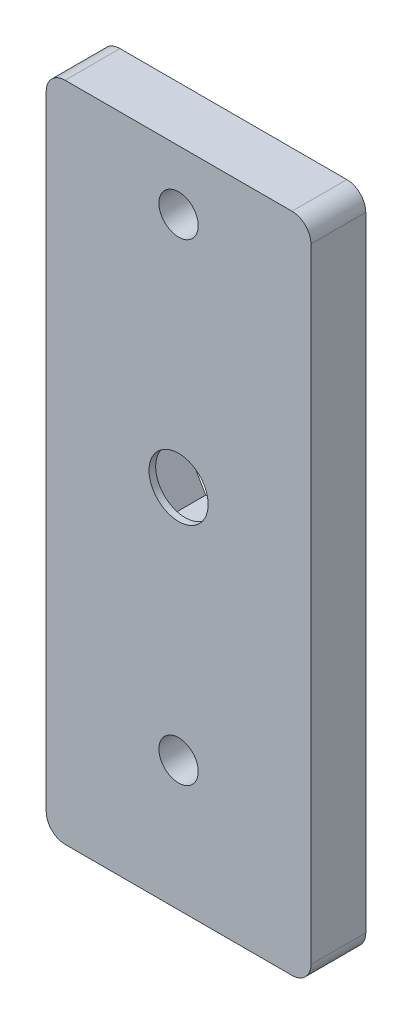
ISO-10303-21;
HEADER;
FILE_DESCRIPTION(('STEP AP214'),'2;1');
FILE_NAME('part.step','',(''),(''),'','','');
FILE_SCHEMA(('AUTOMOTIVE_DESIGN { 1 0 10303 214 1 1 1 1 }'));
ENDSEC;
DATA;
#1=APPLICATION_CONTEXT('core data for automotive mechanical design processes');
#2=APPLICATION_PROTOCOL_DEFINITION('international standard','automotive_design',2000,#1);
#3=PRODUCT_CONTEXT('',#1,'mechanical');
#4=PRODUCT('Part','Part','',(#3));
#5=PRODUCT_RELATED_PRODUCT_CATEGORY('part','',(#4));
#6=PRODUCT_DEFINITION_FORMATION('','',#4);
#7=PRODUCT_DEFINITION_CONTEXT('part definition',#1,'design');
#8=PRODUCT_DEFINITION('design','',#6,#7);
#9=PRODUCT_DEFINITION_SHAPE('','',#8);
#10=(LENGTH_UNIT() NAMED_UNIT(*) SI_UNIT(.MILLI.,.METRE.));
#11=(NAMED_UNIT(*) PLANE_ANGLE_UNIT() SI_UNIT($,.RADIAN.));
#12=(NAMED_UNIT(*) SI_UNIT($,.STERADIAN.) SOLID_ANGLE_UNIT());
#13=UNCERTAINTY_MEASURE_WITH_UNIT(LENGTH_MEASURE(1.E-05),#10,'distance_accuracy_value','');
#14=(GEOMETRIC_REPRESENTATION_CONTEXT(3) GLOBAL_UNCERTAINTY_ASSIGNED_CONTEXT((#13)) GLOBAL_UNIT_ASSIGNED_CONTEXT((#10,
#11,#12)) REPRESENTATION_CONTEXT('',''));
#15=CARTESIAN_POINT('',(0.,0.,0.));
#16=DIRECTION('',(0.,0.,1.));
#17=DIRECTION('',(1.,0.,0.));
#18=AXIS2_PLACEMENT_3D('',#15,#16,#17);
#19=CARTESIAN_POINT('',(0.,3.70356149548704,5.8));
#20=DIRECTION('',(0.,0.,-1.));
#21=DIRECTION('',(-1.,0.,0.));
#22=AXIS2_PLACEMENT_3D('',#19,#20,#21);
#23=CYLINDRICAL_SURFACE('',#22,3.125);
#24=CARTESIAN_POINT('',(0.,3.70356149548704,5.8));
#25=DIRECTION('',(0.,0.,1.));
#26=DIRECTION('',(1.,0.,0.));
#27=AXIS2_PLACEMENT_3D('',#24,#25,#26);
#28=CIRCLE('',#27,3.125);
#29=CARTESIAN_POINT('',(3.125,3.70356149548704,5.8));
#30=VERTEX_POINT('',#29);
#31=EDGE_CURVE('E196',#30,#30,#28,.T.);
#32=ORIENTED_EDGE('',*,*,#31,.T.);
#33=EDGE_LOOP('',(#32));
#34=FACE_BOUND('',#33,.T.);
#35=CARTESIAN_POINT('',(0.,3.70356149548704,5.1));
#36=DIRECTION('',(0.,0.,-1.));
#37=DIRECTION('',(-1.,0.,0.));
#38=AXIS2_PLACEMENT_3D('',#35,#36,#37);
#39=CIRCLE('',#38,3.125);
#40=CARTESIAN_POINT('',(-3.125,3.70356149548704,5.1));
#41=VERTEX_POINT('',#40);
#42=EDGE_CURVE('E185',#41,#41,#39,.T.);
#43=ORIENTED_EDGE('',*,*,#42,.T.);
#44=EDGE_LOOP('',(#43));
#45=FACE_BOUND('',#44,.T.);
#46=ADVANCED_FACE('F32',(#34,#45),#23,.F.);
#47=CARTESIAN_POINT('',(0.,0.,5.8));
#48=DIRECTION('',(0.,0.,1.));
#49=DIRECTION('',(1.,0.,0.));
#50=AXIS2_PLACEMENT_3D('',#47,#48,#49);
#51=PLANE('',#50);
#52=ORIENTED_EDGE('',*,*,#31,.F.);
#53=EDGE_LOOP('',(#52));
#54=FACE_BOUND('',#53,.T.);
#55=DIRECTION('',(1.,0.,0.));
#56=VECTOR('',#55,1.);
#57=CARTESIAN_POINT('',(-13.9985071332541,-35.,5.8));
#58=LINE('',#57,#56);
#59=CARTESIAN_POINT('',(-11.9985071332541,-35.,5.8));
#60=VERTEX_POINT('',#59);
#61=CARTESIAN_POINT('',(12.,-35.,5.8));
#62=VERTEX_POINT('',#61);
#63=EDGE_CURVE('E212',#60,#62,#58,.T.);
#64=ORIENTED_EDGE('',*,*,#63,.T.);
#65=CARTESIAN_POINT('',(12.,-33.,5.8));
#66=DIRECTION('',(0.,0.,1.));
#67=DIRECTION('',(1.,0.,0.));
#68=AXIS2_PLACEMENT_3D('',#65,#66,#67);
#69=CIRCLE('',#68,2.);
#70=CARTESIAN_POINT('',(14.,-33.,5.8));
#71=VERTEX_POINT('',#70);
#72=EDGE_CURVE('E254',#62,#71,#69,.T.);
#73=ORIENTED_EDGE('',*,*,#72,.T.);
#74=DIRECTION('',(0.,1.,0.));
#75=VECTOR('',#74,1.);
#76=CARTESIAN_POINT('',(14.,34.9980030059815,5.8));
#77=LINE('',#76,#75);
#78=CARTESIAN_POINT('',(14.,32.9980030059815,5.8));
#79=VERTEX_POINT('',#78);
#80=EDGE_CURVE('E216',#71,#79,#77,.T.);
#81=ORIENTED_EDGE('',*,*,#80,.T.);
#82=CARTESIAN_POINT('',(12.,32.9980030059815,5.8));
#83=DIRECTION('',(0.,0.,1.));
#84=DIRECTION('',(1.,0.,0.));
#85=AXIS2_PLACEMENT_3D('',#82,#83,#84);
#86=CIRCLE('',#85,2.);
#87=CARTESIAN_POINT('',(12.,34.9980030059815,5.8));
#88=VERTEX_POINT('',#87);
#89=EDGE_CURVE('E53',#79,#88,#86,.T.);
#90=ORIENTED_EDGE('',*,*,#89,.T.);
#91=DIRECTION('',(-1.,0.,0.));
#92=VECTOR('',#91,1.);
#93=CARTESIAN_POINT('',(-13.9985071332541,34.9980030059815,5.8));
#94=LINE('',#93,#92);
#95=CARTESIAN_POINT('',(-11.9985071332541,34.9980030059815,5.8));
#96=VERTEX_POINT('',#95);
#97=EDGE_CURVE('E218',#88,#96,#94,.T.);
#98=ORIENTED_EDGE('',*,*,#97,.T.);
#99=CARTESIAN_POINT('',(-11.9985071332541,32.9980030059815,5.8));
#100=DIRECTION('',(0.,0.,1.));
#101=DIRECTION('',(1.,0.,0.));
#102=AXIS2_PLACEMENT_3D('',#99,#100,#101);
#103=CIRCLE('',#102,2.);
#104=CARTESIAN_POINT('',(-13.9985071332541,32.9980030059815,5.8));
#105=VERTEX_POINT('',#104);
#106=EDGE_CURVE('E249',#96,#105,#103,.T.);
#107=ORIENTED_EDGE('',*,*,#106,.T.);
#108=DIRECTION('',(0.,-1.,0.));
#109=VECTOR('',#108,1.);
#110=CARTESIAN_POINT('',(-13.9985071332541,34.9980030059815,5.8));
#111=LINE('',#110,#109);
#112=CARTESIAN_POINT('',(-13.9985071332541,-33.,5.8));
#113=VERTEX_POINT('',#112);
#114=EDGE_CURVE('E209',#105,#113,#111,.T.);
#115=ORIENTED_EDGE('',*,*,#114,.T.);
#116=CARTESIAN_POINT('',(-11.9985071332541,-33.,5.8));
#117=DIRECTION('',(0.,0.,1.));
#118=DIRECTION('',(1.,0.,0.));
#119=AXIS2_PLACEMENT_3D('',#116,#117,#118);
#120=CIRCLE('',#119,2.);
#121=EDGE_CURVE('E252',#113,#60,#120,.T.);
#122=ORIENTED_EDGE('',*,*,#121,.T.);
#123=EDGE_LOOP('',(#64,#73,#81,#90,#98,#107,#115,#122));
#124=FACE_BOUND('',#123,.T.);
#125=CARTESIAN_POINT('',(0.000493892899487702,-21.2950005531311,5.8));
#126=DIRECTION('',(0.,0.,1.));
#127=DIRECTION('',(1.,0.,0.));
#128=AXIS2_PLACEMENT_3D('',#125,#126,#127);
#129=CIRCLE('',#128,2.07899999618531);
#130=CARTESIAN_POINT('',(2.07949388908479,-21.2950005531311,5.8));
#131=VERTEX_POINT('',#130);
#132=EDGE_CURVE('E203',#131,#131,#129,.T.);
#133=ORIENTED_EDGE('',*,*,#132,.F.);
#134=EDGE_LOOP('',(#133));
#135=FACE_BOUND('',#134,.T.);
#136=CARTESIAN_POINT('',(0.000493654481067279,28.7050018310547,5.8));
#137=DIRECTION('',(0.,0.,1.));
#138=DIRECTION('',(1.,0.,0.));
#139=AXIS2_PLACEMENT_3D('',#136,#137,#138);
#140=CIRCLE('',#139,2.07889414573671);
#141=CARTESIAN_POINT('',(2.07938780021777,28.7050018310547,5.8));
#142=VERTEX_POINT('',#141);
#143=EDGE_CURVE('E193',#142,#142,#140,.T.);
#144=ORIENTED_EDGE('',*,*,#143,.F.);
#145=EDGE_LOOP('',(#144));
#146=FACE_BOUND('',#145,.T.);
#147=ADVANCED_FACE('F268',(#54,#124,#135,#146),#51,.T.);
#148=CARTESIAN_POINT('',(0.,0.,0.));
#149=DIRECTION('',(0.,0.,1.));
#150=DIRECTION('',(1.,0.,0.));
#151=AXIS2_PLACEMENT_3D('',#148,#149,#150);
#152=PLANE('',#151);
#153=DIRECTION('',(1.,0.,0.));
#154=VECTOR('',#153,1.);
#155=CARTESIAN_POINT('',(-2.92875357803167,8.77631149548704,0.));
#156=LINE('',#155,#154);
#157=CARTESIAN_POINT('',(-2.92875357803167,8.77631149548704,0.));
#158=VERTEX_POINT('',#157);
#159=CARTESIAN_POINT('',(2.92875357803168,8.77631149548701,0.));
#160=VERTEX_POINT('',#159);
#161=EDGE_CURVE('E173',#158,#160,#156,.T.);
#162=ORIENTED_EDGE('',*,*,#161,.F.);
#163=DIRECTION('',(0.500000000000004,0.866025403784436,0.));
#164=VECTOR('',#163,1.);
#165=CARTESIAN_POINT('',(-5.85750715606336,3.70356149548706,0.));
#166=LINE('',#165,#164);
#167=CARTESIAN_POINT('',(-5.85750715606336,3.70356149548706,0.));
#168=VERTEX_POINT('',#167);
#169=EDGE_CURVE('E141',#168,#158,#166,.T.);
#170=ORIENTED_EDGE('',*,*,#169,.F.);
#171=DIRECTION('',(-0.499999999999996,0.866025403784441,0.));
#172=VECTOR('',#171,1.);
#173=CARTESIAN_POINT('',(-2.9287535780317,-1.36918850451296,0.));
#174=LINE('',#173,#172);
#175=CARTESIAN_POINT('',(-2.9287535780317,-1.36918850451296,0.));
#176=VERTEX_POINT('',#175);
#177=EDGE_CURVE('E159',#176,#168,#174,.T.);
#178=ORIENTED_EDGE('',*,*,#177,.F.);
#179=DIRECTION('',(-1.,0.,0.));
#180=VECTOR('',#179,1.);
#181=CARTESIAN_POINT('',(2.92875357803165,-1.36918850451299,0.));
#182=LINE('',#181,#180);
#183=CARTESIAN_POINT('',(2.92875357803165,-1.36918850451299,0.));
#184=VERTEX_POINT('',#183);
#185=EDGE_CURVE('E162',#184,#176,#182,.T.);
#186=ORIENTED_EDGE('',*,*,#185,.F.);
#187=DIRECTION('',(-0.500000000000002,-0.866025403784438,0.));
#188=VECTOR('',#187,1.);
#189=CARTESIAN_POINT('',(5.85750715606334,3.70356149548702,0.));
#190=LINE('',#189,#188);
#191=CARTESIAN_POINT('',(5.85750715606334,3.70356149548702,0.));
#192=VERTEX_POINT('',#191);
#193=EDGE_CURVE('E178',#192,#184,#190,.T.);
#194=ORIENTED_EDGE('',*,*,#193,.F.);
#195=DIRECTION('',(0.499999999999999,-0.866025403784439,0.));
#196=VECTOR('',#195,1.);
#197=CARTESIAN_POINT('',(2.92875357803168,8.77631149548701,0.));
#198=LINE('',#197,#196);
#199=EDGE_CURVE('E175',#160,#192,#198,.T.);
#200=ORIENTED_EDGE('',*,*,#199,.F.);
#201=EDGE_LOOP('',(#162,#170,#178,#186,#194,#200));
#202=FACE_BOUND('',#201,.T.);
#203=DIRECTION('',(0.,1.,0.));
#204=VECTOR('',#203,1.);
#205=CARTESIAN_POINT('',(14.,34.9980030059815,0.));
#206=LINE('',#205,#204);
#207=CARTESIAN_POINT('',(14.,-33.,0.));
#208=VERTEX_POINT('',#207);
#209=CARTESIAN_POINT('',(14.,32.9980030059815,0.));
#210=VERTEX_POINT('',#209);
#211=EDGE_CURVE('E226',#208,#210,#206,.T.);
#212=ORIENTED_EDGE('',*,*,#211,.F.);
#213=CARTESIAN_POINT('',(12.,-33.,0.));
#214=DIRECTION('',(0.,0.,1.));
#215=DIRECTION('',(1.,0.,0.));
#216=AXIS2_PLACEMENT_3D('',#213,#214,#215);
#217=CIRCLE('',#216,2.);
#218=CARTESIAN_POINT('',(12.,-35.,0.));
#219=VERTEX_POINT('',#218);
#220=EDGE_CURVE('E242',#208,#219,#217,.F.);
#221=ORIENTED_EDGE('',*,*,#220,.T.);
#222=DIRECTION('',(1.,0.,0.));
#223=VECTOR('',#222,1.);
#224=CARTESIAN_POINT('',(-13.9985071332541,-35.,0.));
#225=LINE('',#224,#223);
#226=CARTESIAN_POINT('',(-11.9985071332541,-35.,0.));
#227=VERTEX_POINT('',#226);
#228=EDGE_CURVE('E223',#227,#219,#225,.T.);
#229=ORIENTED_EDGE('',*,*,#228,.F.);
#230=CARTESIAN_POINT('',(-11.9985071332541,-33.,0.));
#231=DIRECTION('',(0.,0.,1.));
#232=DIRECTION('',(1.,0.,0.));
#233=AXIS2_PLACEMENT_3D('',#230,#231,#232);
#234=CIRCLE('',#233,2.);
#235=CARTESIAN_POINT('',(-13.9985071332541,-33.,0.));
#236=VERTEX_POINT('',#235);
#237=EDGE_CURVE('E240',#227,#236,#234,.F.);
#238=ORIENTED_EDGE('',*,*,#237,.T.);
#239=DIRECTION('',(0.,-1.,0.));
#240=VECTOR('',#239,1.);
#241=CARTESIAN_POINT('',(-13.9985071332541,34.9980030059815,0.));
#242=LINE('',#241,#240);
#243=CARTESIAN_POINT('',(-13.9985071332541,32.9980030059815,0.));
#244=VERTEX_POINT('',#243);
#245=EDGE_CURVE('E206',#244,#236,#242,.T.);
#246=ORIENTED_EDGE('',*,*,#245,.F.);
#247=CARTESIAN_POINT('',(-11.9985071332541,32.9980030059815,0.));
#248=DIRECTION('',(0.,0.,1.));
#249=DIRECTION('',(1.,0.,0.));
#250=AXIS2_PLACEMENT_3D('',#247,#248,#249);
#251=CIRCLE('',#250,2.);
#252=CARTESIAN_POINT('',(-11.9985071332541,34.9980030059815,0.));
#253=VERTEX_POINT('',#252);
#254=EDGE_CURVE('E236',#244,#253,#251,.F.);
#255=ORIENTED_EDGE('',*,*,#254,.T.);
#256=DIRECTION('',(-1.,0.,0.));
#257=VECTOR('',#256,1.);
#258=CARTESIAN_POINT('',(-13.9985071332541,34.9980030059815,0.));
#259=LINE('',#258,#257);
#260=CARTESIAN_POINT('',(12.,34.9980030059815,0.));
#261=VERTEX_POINT('',#260);
#262=EDGE_CURVE('E213',#261,#253,#259,.T.);
#263=ORIENTED_EDGE('',*,*,#262,.F.);
#264=CARTESIAN_POINT('',(12.,32.9980030059815,0.));
#265=DIRECTION('',(0.,0.,1.));
#266=DIRECTION('',(1.,0.,0.));
#267=AXIS2_PLACEMENT_3D('',#264,#265,#266);
#268=CIRCLE('',#267,2.);
#269=EDGE_CURVE('E238',#261,#210,#268,.F.);
#270=ORIENTED_EDGE('',*,*,#269,.T.);
#271=EDGE_LOOP('',(#212,#221,#229,#238,#246,#255,#263,#270));
#272=FACE_BOUND('',#271,.T.);
#273=CARTESIAN_POINT('',(0.000493892899487702,-21.2950005531311,0.));
#274=DIRECTION('',(0.,0.,1.));
#275=DIRECTION('',(1.,0.,0.));
#276=AXIS2_PLACEMENT_3D('',#273,#274,#275);
#277=CIRCLE('',#276,2.07899999618531);
#278=CARTESIAN_POINT('',(2.07949388908479,-21.2950005531311,0.));
#279=VERTEX_POINT('',#278);
#280=EDGE_CURVE('E202',#279,#279,#277,.T.);
#281=ORIENTED_EDGE('',*,*,#280,.T.);
#282=EDGE_LOOP('',(#281));
#283=FACE_BOUND('',#282,.T.);
#284=CARTESIAN_POINT('',(0.000493654481067279,28.7050018310547,0.));
#285=DIRECTION('',(0.,0.,1.));
#286=DIRECTION('',(1.,0.,0.));
#287=AXIS2_PLACEMENT_3D('',#284,#285,#286);
#288=CIRCLE('',#287,2.07889414573671);
#289=CARTESIAN_POINT('',(2.07938780021777,28.7050018310547,0.));
#290=VERTEX_POINT('',#289);
#291=EDGE_CURVE('E197',#290,#290,#288,.T.);
#292=ORIENTED_EDGE('',*,*,#291,.T.);
#293=EDGE_LOOP('',(#292));
#294=FACE_BOUND('',#293,.T.);
#295=ADVANCED_FACE('F280',(#202,#272,#283,#294),#152,.F.);
#296=CARTESIAN_POINT('',(-13.9985071332541,34.9980030059815,5.8));
#297=DIRECTION('',(1.,0.,0.));
#298=DIRECTION('',(0.,1.,0.));
#299=AXIS2_PLACEMENT_3D('',#296,#297,#298);
#300=PLANE('',#299);
#301=ORIENTED_EDGE('',*,*,#245,.T.);
#302=DIRECTION('',(0.,0.,-1.));
#303=VECTOR('',#302,1.);
#304=CARTESIAN_POINT('',(-13.9985071332541,-33.,5.8));
#305=LINE('',#304,#303);
#306=EDGE_CURVE('E259',#236,#113,#305,.F.);
#307=ORIENTED_EDGE('',*,*,#306,.T.);
#308=ORIENTED_EDGE('',*,*,#114,.F.);
#309=DIRECTION('',(0.,0.,-1.));
#310=VECTOR('',#309,1.);
#311=CARTESIAN_POINT('',(-13.9985071332541,32.9980030059815,5.8));
#312=LINE('',#311,#310);
#313=EDGE_CURVE('E256',#105,#244,#312,.T.);
#314=ORIENTED_EDGE('',*,*,#313,.T.);
#315=EDGE_LOOP('',(#301,#307,#308,#314));
#316=FACE_BOUND('',#315,.T.);
#317=ADVANCED_FACE('F263',(#316),#300,.F.);
#318=CARTESIAN_POINT('',(-13.9985071332541,-35.,5.8));
#319=DIRECTION('',(0.,1.,0.));
#320=DIRECTION('',(0.,0.,1.));
#321=AXIS2_PLACEMENT_3D('',#318,#319,#320);
#322=PLANE('',#321);
#323=ORIENTED_EDGE('',*,*,#228,.T.);
#324=DIRECTION('',(0.,0.,-1.));
#325=VECTOR('',#324,1.);
#326=CARTESIAN_POINT('',(12.,-35.,5.8));
#327=LINE('',#326,#325);
#328=EDGE_CURVE('E247',#219,#62,#327,.F.);
#329=ORIENTED_EDGE('',*,*,#328,.T.);
#330=ORIENTED_EDGE('',*,*,#63,.F.);
#331=DIRECTION('',(0.,0.,-1.));
#332=VECTOR('',#331,1.);
#333=CARTESIAN_POINT('',(-11.9985071332541,-35.,5.8));
#334=LINE('',#333,#332);
#335=EDGE_CURVE('E244',#60,#227,#334,.T.);
#336=ORIENTED_EDGE('',*,*,#335,.T.);
#337=EDGE_LOOP('',(#323,#329,#330,#336));
#338=FACE_BOUND('',#337,.T.);
#339=ADVANCED_FACE('F276',(#338),#322,.F.);
#340=CARTESIAN_POINT('',(14.,34.9980030059815,5.8));
#341=DIRECTION('',(-1.,0.,0.));
#342=DIRECTION('',(0.,-1.,0.));
#343=AXIS2_PLACEMENT_3D('',#340,#341,#342);
#344=PLANE('',#343);
#345=ORIENTED_EDGE('',*,*,#80,.F.);
#346=DIRECTION('',(0.,0.,-1.));
#347=VECTOR('',#346,1.);
#348=CARTESIAN_POINT('',(14.,-33.,5.8));
#349=LINE('',#348,#347);
#350=EDGE_CURVE('E233',#71,#208,#349,.T.);
#351=ORIENTED_EDGE('',*,*,#350,.T.);
#352=ORIENTED_EDGE('',*,*,#211,.T.);
#353=DIRECTION('',(0.,0.,-1.));
#354=VECTOR('',#353,1.);
#355=CARTESIAN_POINT('',(14.,32.9980030059815,5.8));
#356=LINE('',#355,#354);
#357=EDGE_CURVE('E220',#210,#79,#356,.F.);
#358=ORIENTED_EDGE('',*,*,#357,.T.);
#359=EDGE_LOOP('',(#345,#351,#352,#358));
#360=FACE_BOUND('',#359,.T.);
#361=ADVANCED_FACE('F288',(#360),#344,.F.);
#362=CARTESIAN_POINT('',(-13.9985071332541,34.9980030059815,5.8));
#363=DIRECTION('',(0.,-1.,0.));
#364=DIRECTION('',(0.,0.,-1.));
#365=AXIS2_PLACEMENT_3D('',#362,#363,#364);
#366=PLANE('',#365);
#367=ORIENTED_EDGE('',*,*,#97,.F.);
#368=DIRECTION('',(0.,0.,-1.));
#369=VECTOR('',#368,1.);
#370=CARTESIAN_POINT('',(12.,34.9980030059815,5.8));
#371=LINE('',#370,#369);
#372=EDGE_CURVE('E11',#88,#261,#371,.T.);
#373=ORIENTED_EDGE('',*,*,#372,.T.);
#374=ORIENTED_EDGE('',*,*,#262,.T.);
#375=DIRECTION('',(0.,0.,-1.));
#376=VECTOR('',#375,1.);
#377=CARTESIAN_POINT('',(-11.9985071332541,34.9980030059815,5.8));
#378=LINE('',#377,#376);
#379=EDGE_CURVE('E40',#253,#96,#378,.F.);
#380=ORIENTED_EDGE('',*,*,#379,.T.);
#381=EDGE_LOOP('',(#367,#373,#374,#380));
#382=FACE_BOUND('',#381,.T.);
#383=ADVANCED_FACE('F294',(#382),#366,.F.);
#384=CARTESIAN_POINT('',(0.000493892899487702,-21.2950005531311,5.8));
#385=DIRECTION('',(0.,0.,-1.));
#386=DIRECTION('',(-1.,0.,0.));
#387=AXIS2_PLACEMENT_3D('',#384,#385,#386);
#388=CYLINDRICAL_SURFACE('',#387,2.07899999618531);
#389=ORIENTED_EDGE('',*,*,#132,.T.);
#390=EDGE_LOOP('',(#389));
#391=FACE_BOUND('',#390,.T.);
#392=ORIENTED_EDGE('',*,*,#280,.F.);
#393=EDGE_LOOP('',(#392));
#394=FACE_BOUND('',#393,.T.);
#395=ADVANCED_FACE('F313',(#391,#394),#388,.F.);
#396=CARTESIAN_POINT('',(0.000493654481067279,28.7050018310547,5.8));
#397=DIRECTION('',(0.,0.,-1.));
#398=DIRECTION('',(-1.,0.,0.));
#399=AXIS2_PLACEMENT_3D('',#396,#397,#398);
#400=CYLINDRICAL_SURFACE('',#399,2.07889414573671);
#401=ORIENTED_EDGE('',*,*,#143,.T.);
#402=EDGE_LOOP('',(#401));
#403=FACE_BOUND('',#402,.T.);
#404=ORIENTED_EDGE('',*,*,#291,.F.);
#405=EDGE_LOOP('',(#404));
#406=FACE_BOUND('',#405,.T.);
#407=ADVANCED_FACE('F311',(#403,#406),#400,.F.);
#408=CARTESIAN_POINT('',(-5.85750715606336,3.70356149548706,5.1));
#409=DIRECTION('',(-0.866025403784436,0.500000000000004,0.));
#410=DIRECTION('',(-0.500000000000004,-0.866025403784436,0.));
#411=AXIS2_PLACEMENT_3D('',#408,#409,#410);
#412=PLANE('',#411);
#413=ORIENTED_EDGE('',*,*,#169,.T.);
#414=DIRECTION('',(0.,0.,-1.));
#415=VECTOR('',#414,1.);
#416=CARTESIAN_POINT('',(-2.92875357803167,8.77631149548704,5.1));
#417=LINE('',#416,#415);
#418=CARTESIAN_POINT('',(-2.92875357803167,8.77631149548704,5.1));
#419=VERTEX_POINT('',#418);
#420=EDGE_CURVE('E134',#419,#158,#417,.T.);
#421=ORIENTED_EDGE('',*,*,#420,.F.);
#422=DIRECTION('',(0.500000000000004,0.866025403784436,0.));
#423=VECTOR('',#422,1.);
#424=CARTESIAN_POINT('',(-5.85750715606336,3.70356149548706,5.1));
#425=LINE('',#424,#423);
#426=CARTESIAN_POINT('',(-5.85750715606336,3.70356149548706,5.1));
#427=VERTEX_POINT('',#426);
#428=EDGE_CURVE('E138',#427,#419,#425,.T.);
#429=ORIENTED_EDGE('',*,*,#428,.F.);
#430=DIRECTION('',(0.,0.,-1.));
#431=VECTOR('',#430,1.);
#432=CARTESIAN_POINT('',(-5.85750715606336,3.70356149548706,5.1));
#433=LINE('',#432,#431);
#434=EDGE_CURVE('E183',#427,#168,#433,.T.);
#435=ORIENTED_EDGE('',*,*,#434,.T.);
#436=EDGE_LOOP('',(#413,#421,#429,#435));
#437=FACE_BOUND('',#436,.T.);
#438=ADVANCED_FACE('F136',(#437),#412,.F.);
#439=CARTESIAN_POINT('',(-2.9287535780317,-1.36918850451296,5.1));
#440=DIRECTION('',(-0.866025403784441,-0.499999999999996,0.));
#441=DIRECTION('',(0.499999999999996,-0.866025403784441,0.));
#442=AXIS2_PLACEMENT_3D('',#439,#440,#441);
#443=PLANE('',#442);
#444=ORIENTED_EDGE('',*,*,#177,.T.);
#445=ORIENTED_EDGE('',*,*,#434,.F.);
#446=DIRECTION('',(-0.499999999999996,0.866025403784441,0.));
#447=VECTOR('',#446,1.);
#448=CARTESIAN_POINT('',(-2.9287535780317,-1.36918850451296,5.1));
#449=LINE('',#448,#447);
#450=CARTESIAN_POINT('',(-2.9287535780317,-1.36918850451296,5.1));
#451=VERTEX_POINT('',#450);
#452=EDGE_CURVE('E146',#451,#427,#449,.T.);
#453=ORIENTED_EDGE('',*,*,#452,.F.);
#454=DIRECTION('',(0.,0.,-1.));
#455=VECTOR('',#454,1.);
#456=CARTESIAN_POINT('',(-2.9287535780317,-1.36918850451296,5.1));
#457=LINE('',#456,#455);
#458=EDGE_CURVE('E186',#451,#176,#457,.T.);
#459=ORIENTED_EDGE('',*,*,#458,.T.);
#460=EDGE_LOOP('',(#444,#445,#453,#459));
#461=FACE_BOUND('',#460,.T.);
#462=ADVANCED_FACE('F395',(#461),#443,.F.);
#463=CARTESIAN_POINT('',(2.92875357803165,-1.36918850451299,5.1));
#464=DIRECTION('',(0.,-1.,0.));
#465=DIRECTION('',(1.,0.,0.));
#466=AXIS2_PLACEMENT_3D('',#463,#464,#465);
#467=PLANE('',#466);
#468=ORIENTED_EDGE('',*,*,#185,.T.);
#469=ORIENTED_EDGE('',*,*,#458,.F.);
#470=DIRECTION('',(-1.,0.,0.));
#471=VECTOR('',#470,1.);
#472=CARTESIAN_POINT('',(2.92875357803165,-1.36918850451299,5.1));
#473=LINE('',#472,#471);
#474=CARTESIAN_POINT('',(2.92875357803165,-1.36918850451299,5.1));
#475=VERTEX_POINT('',#474);
#476=EDGE_CURVE('E169',#475,#451,#473,.T.);
#477=ORIENTED_EDGE('',*,*,#476,.F.);
#478=DIRECTION('',(0.,0.,-1.));
#479=VECTOR('',#478,1.);
#480=CARTESIAN_POINT('',(2.92875357803165,-1.36918850451299,5.1));
#481=LINE('',#480,#479);
#482=EDGE_CURVE('E188',#475,#184,#481,.T.);
#483=ORIENTED_EDGE('',*,*,#482,.T.);
#484=EDGE_LOOP('',(#468,#469,#477,#483));
#485=FACE_BOUND('',#484,.T.);
#486=ADVANCED_FACE('F386',(#485),#467,.F.);
#487=CARTESIAN_POINT('',(5.85750715606334,3.70356149548702,5.1));
#488=DIRECTION('',(0.866025403784438,-0.500000000000002,0.));
#489=DIRECTION('',(0.500000000000002,0.866025403784438,0.));
#490=AXIS2_PLACEMENT_3D('',#487,#488,#489);
#491=PLANE('',#490);
#492=ORIENTED_EDGE('',*,*,#193,.T.);
#493=ORIENTED_EDGE('',*,*,#482,.F.);
#494=DIRECTION('',(-0.500000000000002,-0.866025403784438,0.));
#495=VECTOR('',#494,1.);
#496=CARTESIAN_POINT('',(5.85750715606334,3.70356149548702,5.1));
#497=LINE('',#496,#495);
#498=CARTESIAN_POINT('',(5.85750715606334,3.70356149548702,5.1));
#499=VERTEX_POINT('',#498);
#500=EDGE_CURVE('E166',#499,#475,#497,.T.);
#501=ORIENTED_EDGE('',*,*,#500,.F.);
#502=DIRECTION('',(0.,0.,-1.));
#503=VECTOR('',#502,1.);
#504=CARTESIAN_POINT('',(5.85750715606334,3.70356149548702,5.1));
#505=LINE('',#504,#503);
#506=EDGE_CURVE('E190',#499,#192,#505,.T.);
#507=ORIENTED_EDGE('',*,*,#506,.T.);
#508=EDGE_LOOP('',(#492,#493,#501,#507));
#509=FACE_BOUND('',#508,.T.);
#510=ADVANCED_FACE('F377',(#509),#491,.F.);
#511=CARTESIAN_POINT('',(2.92875357803168,8.77631149548701,5.1));
#512=DIRECTION('',(0.866025403784439,0.499999999999999,0.));
#513=DIRECTION('',(-0.499999999999999,0.866025403784439,0.));
#514=AXIS2_PLACEMENT_3D('',#511,#512,#513);
#515=PLANE('',#514);
#516=ORIENTED_EDGE('',*,*,#199,.T.);
#517=ORIENTED_EDGE('',*,*,#506,.F.);
#518=DIRECTION('',(0.499999999999999,-0.866025403784439,0.));
#519=VECTOR('',#518,1.);
#520=CARTESIAN_POINT('',(2.92875357803168,8.77631149548701,5.1));
#521=LINE('',#520,#519);
#522=CARTESIAN_POINT('',(2.92875357803168,8.77631149548701,5.1));
#523=VERTEX_POINT('',#522);
#524=EDGE_CURVE('E154',#523,#499,#521,.T.);
#525=ORIENTED_EDGE('',*,*,#524,.F.);
#526=DIRECTION('',(0.,0.,-1.));
#527=VECTOR('',#526,1.);
#528=CARTESIAN_POINT('',(2.92875357803168,8.77631149548701,5.1));
#529=LINE('',#528,#527);
#530=EDGE_CURVE('E145',#523,#160,#529,.T.);
#531=ORIENTED_EDGE('',*,*,#530,.T.);
#532=EDGE_LOOP('',(#516,#517,#525,#531));
#533=FACE_BOUND('',#532,.T.);
#534=ADVANCED_FACE('F369',(#533),#515,.F.);
#535=CARTESIAN_POINT('',(-2.92875357803167,8.77631149548704,5.1));
#536=DIRECTION('',(0.,1.,0.));
#537=DIRECTION('',(-1.,0.,0.));
#538=AXIS2_PLACEMENT_3D('',#535,#536,#537);
#539=PLANE('',#538);
#540=ORIENTED_EDGE('',*,*,#161,.T.);
#541=ORIENTED_EDGE('',*,*,#530,.F.);
#542=DIRECTION('',(1.,0.,0.));
#543=VECTOR('',#542,1.);
#544=CARTESIAN_POINT('',(-2.92875357803167,8.77631149548704,5.1));
#545=LINE('',#544,#543);
#546=EDGE_CURVE('E149',#419,#523,#545,.T.);
#547=ORIENTED_EDGE('',*,*,#546,.F.);
#548=ORIENTED_EDGE('',*,*,#420,.T.);
#549=EDGE_LOOP('',(#540,#541,#547,#548));
#550=FACE_BOUND('',#549,.T.);
#551=ADVANCED_FACE('F150',(#550),#539,.F.);
#552=CARTESIAN_POINT('',(0.,0.,5.1));
#553=DIRECTION('',(0.,0.,-1.));
#554=DIRECTION('',(-1.,0.,0.));
#555=AXIS2_PLACEMENT_3D('',#552,#553,#554);
#556=PLANE('',#555);
#557=ORIENTED_EDGE('',*,*,#42,.F.);
#558=EDGE_LOOP('',(#557));
#559=FACE_BOUND('',#558,.T.);
#560=ORIENTED_EDGE('',*,*,#428,.T.);
#561=ORIENTED_EDGE('',*,*,#546,.T.);
#562=ORIENTED_EDGE('',*,*,#524,.T.);
#563=ORIENTED_EDGE('',*,*,#500,.T.);
#564=ORIENTED_EDGE('',*,*,#476,.T.);
#565=ORIENTED_EDGE('',*,*,#452,.T.);
#566=EDGE_LOOP('',(#560,#561,#562,#563,#564,#565));
#567=FACE_BOUND('',#566,.T.);
#568=ADVANCED_FACE('F156',(#559,#567),#556,.T.);
#569=CARTESIAN_POINT('',(12.,-33.,5.8));
#570=DIRECTION('',(0.,0.,-1.));
#571=DIRECTION('',(-1.,0.,0.));
#572=AXIS2_PLACEMENT_3D('',#569,#570,#571);
#573=CYLINDRICAL_SURFACE('',#572,2.);
#574=ORIENTED_EDGE('',*,*,#72,.F.);
#575=ORIENTED_EDGE('',*,*,#328,.F.);
#576=ORIENTED_EDGE('',*,*,#220,.F.);
#577=ORIENTED_EDGE('',*,*,#350,.F.);
#578=EDGE_LOOP('',(#574,#575,#576,#577));
#579=FACE_BOUND('',#578,.T.);
#580=ADVANCED_FACE('F285',(#579),#573,.T.);
#581=CARTESIAN_POINT('',(-11.9985071332541,-33.,5.8));
#582=DIRECTION('',(0.,0.,-1.));
#583=DIRECTION('',(-1.,0.,0.));
#584=AXIS2_PLACEMENT_3D('',#581,#582,#583);
#585=CYLINDRICAL_SURFACE('',#584,2.);
#586=ORIENTED_EDGE('',*,*,#121,.F.);
#587=ORIENTED_EDGE('',*,*,#306,.F.);
#588=ORIENTED_EDGE('',*,*,#237,.F.);
#589=ORIENTED_EDGE('',*,*,#335,.F.);
#590=EDGE_LOOP('',(#586,#587,#588,#589));
#591=FACE_BOUND('',#590,.T.);
#592=ADVANCED_FACE('F273',(#591),#585,.T.);
#593=CARTESIAN_POINT('',(12.,32.9980030059815,5.8));
#594=DIRECTION('',(0.,0.,-1.));
#595=DIRECTION('',(-1.,0.,0.));
#596=AXIS2_PLACEMENT_3D('',#593,#594,#595);
#597=CYLINDRICAL_SURFACE('',#596,2.);
#598=ORIENTED_EDGE('',*,*,#89,.F.);
#599=ORIENTED_EDGE('',*,*,#357,.F.);
#600=ORIENTED_EDGE('',*,*,#269,.F.);
#601=ORIENTED_EDGE('',*,*,#372,.F.);
#602=EDGE_LOOP('',(#598,#599,#600,#601));
#603=FACE_BOUND('',#602,.T.);
#604=ADVANCED_FACE('F292',(#603),#597,.T.);
#605=CARTESIAN_POINT('',(-11.9985071332541,32.9980030059815,5.8));
#606=DIRECTION('',(0.,0.,-1.));
#607=DIRECTION('',(-1.,0.,0.));
#608=AXIS2_PLACEMENT_3D('',#605,#606,#607);
#609=CYLINDRICAL_SURFACE('',#608,2.);
#610=ORIENTED_EDGE('',*,*,#106,.F.);
#611=ORIENTED_EDGE('',*,*,#379,.F.);
#612=ORIENTED_EDGE('',*,*,#254,.F.);
#613=ORIENTED_EDGE('',*,*,#313,.F.);
#614=EDGE_LOOP('',(#610,#611,#612,#613));
#615=FACE_BOUND('',#614,.T.);
#616=ADVANCED_FACE('F34',(#615),#609,.T.);
#617=CLOSED_SHELL('',(#46,#147,#295,#317,#339,#361,#383,#395,#407,#438,#462,#486,#510,#534,#551,
#568,#580,#592,#604,#616));
#618=MANIFOLD_SOLID_BREP('B2',#617);
#619=ADVANCED_BREP_SHAPE_REPRESENTATION('',(#18,#618),#14);
#620=SHAPE_DEFINITION_REPRESENTATION(#9,#619);
ENDSEC;
END-ISO-10303-21;
